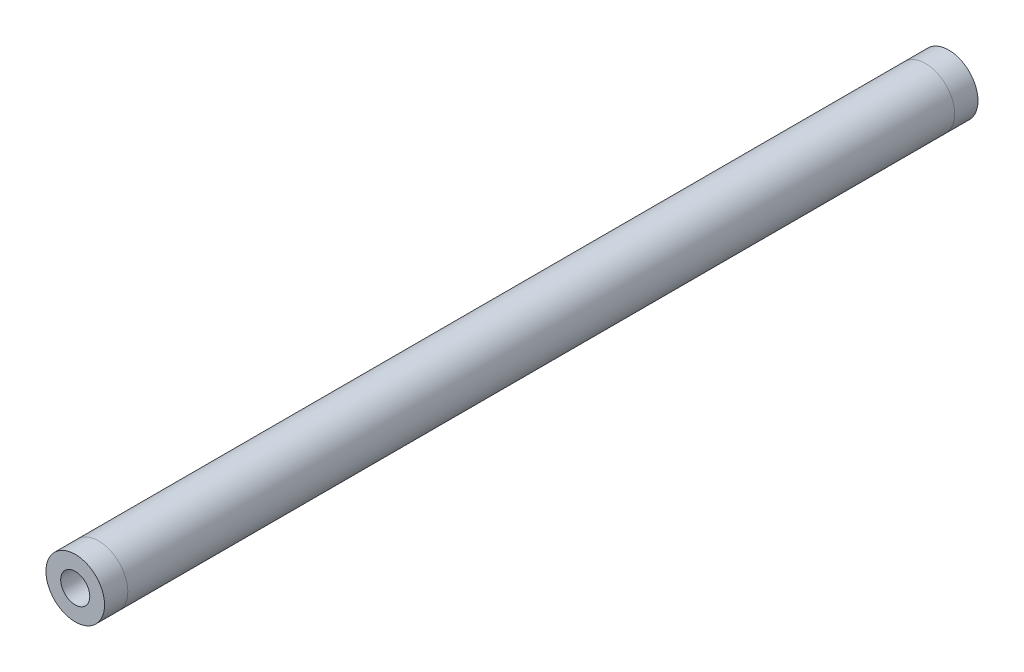
ISO-10303-21;
HEADER;
FILE_DESCRIPTION(('STEP AP214'),'2;1');
FILE_NAME('part.step','',(''),(''),'','','');
FILE_SCHEMA(('AUTOMOTIVE_DESIGN { 1 0 10303 214 1 1 1 1 }'));
ENDSEC;
DATA;
#1=APPLICATION_CONTEXT('core data for automotive mechanical design processes');
#2=APPLICATION_PROTOCOL_DEFINITION('international standard','automotive_design',2000,#1);
#3=PRODUCT_CONTEXT('',#1,'mechanical');
#4=PRODUCT('Part','Part','',(#3));
#5=PRODUCT_RELATED_PRODUCT_CATEGORY('part','',(#4));
#6=PRODUCT_DEFINITION_FORMATION('','',#4);
#7=PRODUCT_DEFINITION_CONTEXT('part definition',#1,'design');
#8=PRODUCT_DEFINITION('design','',#6,#7);
#9=PRODUCT_DEFINITION_SHAPE('','',#8);
#10=(LENGTH_UNIT() NAMED_UNIT(*) SI_UNIT(.MILLI.,.METRE.));
#11=(NAMED_UNIT(*) PLANE_ANGLE_UNIT() SI_UNIT($,.RADIAN.));
#12=(NAMED_UNIT(*) SI_UNIT($,.STERADIAN.) SOLID_ANGLE_UNIT());
#13=UNCERTAINTY_MEASURE_WITH_UNIT(LENGTH_MEASURE(1.E-05),#10,'distance_accuracy_value','');
#14=(GEOMETRIC_REPRESENTATION_CONTEXT(3) GLOBAL_UNCERTAINTY_ASSIGNED_CONTEXT((#13)) GLOBAL_UNIT_ASSIGNED_CONTEXT((#10,
#11,#12)) REPRESENTATION_CONTEXT('',''));
#15=CARTESIAN_POINT('',(0.,0.,0.));
#16=DIRECTION('',(0.,0.,1.));
#17=DIRECTION('',(1.,0.,0.));
#18=AXIS2_PLACEMENT_3D('',#15,#16,#17);
#19=CARTESIAN_POINT('',(0.,0.,-238.513185028254));
#20=DIRECTION('',(0.,0.,1.));
#21=DIRECTION('',(1.,0.,0.));
#22=AXIS2_PLACEMENT_3D('',#19,#20,#21);
#23=CYLINDRICAL_SURFACE('',#22,8.001);
#24=CARTESIAN_POINT('',(0.,0.,-238.513185028254));
#25=DIRECTION('',(0.,0.,1.));
#26=DIRECTION('',(1.,0.,0.));
#27=AXIS2_PLACEMENT_3D('',#24,#25,#26);
#28=CIRCLE('',#27,8.001);
#29=CARTESIAN_POINT('',(8.001,0.,-238.513185028254));
#30=VERTEX_POINT('',#29);
#31=EDGE_CURVE('E83',#30,#30,#28,.T.);
#32=ORIENTED_EDGE('',*,*,#31,.T.);
#33=EDGE_LOOP('',(#32));
#34=FACE_BOUND('',#33,.T.);
#35=CARTESIAN_POINT('',(0.,0.,-232.163185028254));
#36=DIRECTION('',(0.,0.,1.));
#37=DIRECTION('',(1.,0.,0.));
#38=AXIS2_PLACEMENT_3D('',#35,#36,#37);
#39=CIRCLE('',#38,8.001);
#40=CARTESIAN_POINT('',(8.001,0.,-232.163185028254));
#41=VERTEX_POINT('',#40);
#42=EDGE_CURVE('E79',#41,#41,#39,.T.);
#43=ORIENTED_EDGE('',*,*,#42,.F.);
#44=EDGE_LOOP('',(#43));
#45=FACE_BOUND('',#44,.T.);
#46=ADVANCED_FACE('F76',(#34,#45),#23,.T.);
#47=CARTESIAN_POINT('',(0.,0.,-238.513185028254));
#48=DIRECTION('',(0.,0.,1.));
#49=DIRECTION('',(1.,0.,0.));
#50=AXIS2_PLACEMENT_3D('',#47,#48,#49);
#51=PLANE('',#50);
#52=CARTESIAN_POINT('',(0.,0.,-238.513185028254));
#53=DIRECTION('',(0.,0.,1.));
#54=DIRECTION('',(1.,0.,0.));
#55=AXIS2_PLACEMENT_3D('',#52,#53,#54);
#56=CIRCLE('',#55,3.96875);
#57=CARTESIAN_POINT('',(3.96875,0.,-238.513185028254));
#58=VERTEX_POINT('',#57);
#59=EDGE_CURVE('E92',#58,#58,#56,.T.);
#60=ORIENTED_EDGE('',*,*,#59,.T.);
#61=EDGE_LOOP('',(#60));
#62=FACE_BOUND('',#61,.T.);
#63=ORIENTED_EDGE('',*,*,#31,.F.);
#64=EDGE_LOOP('',(#63));
#65=FACE_BOUND('',#64,.T.);
#66=ADVANCED_FACE('F119',(#62,#65),#51,.F.);
#67=CARTESIAN_POINT('',(0.,0.,-232.163185028254));
#68=DIRECTION('',(0.,0.,1.));
#69=DIRECTION('',(1.,0.,0.));
#70=AXIS2_PLACEMENT_3D('',#67,#68,#69);
#71=PLANE('',#70);
#72=CARTESIAN_POINT('',(0.,0.,-232.163185028254));
#73=DIRECTION('',(0.,0.,1.));
#74=DIRECTION('',(1.,0.,0.));
#75=AXIS2_PLACEMENT_3D('',#72,#73,#74);
#76=CIRCLE('',#75,6.477);
#77=CARTESIAN_POINT('',(-6.477,0.,-232.163185028254));
#78=VERTEX_POINT('',#77);
#79=EDGE_CURVE('E12',#78,#78,#76,.T.);
#80=ORIENTED_EDGE('',*,*,#79,.F.);
#81=EDGE_LOOP('',(#80));
#82=FACE_BOUND('',#81,.T.);
#83=ORIENTED_EDGE('',*,*,#42,.T.);
#84=EDGE_LOOP('',(#83));
#85=FACE_BOUND('',#84,.T.);
#86=ADVANCED_FACE('F115',(#82,#85),#71,.T.);
#87=CARTESIAN_POINT('',(0.,0.,-238.513185028254));
#88=DIRECTION('',(0.,0.,1.));
#89=DIRECTION('',(1.,0.,0.));
#90=AXIS2_PLACEMENT_3D('',#87,#88,#89);
#91=CYLINDRICAL_SURFACE('',#90,3.96875);
#92=ORIENTED_EDGE('',*,*,#59,.F.);
#93=EDGE_LOOP('',(#92));
#94=FACE_BOUND('',#93,.T.);
#95=CARTESIAN_POINT('',(0.,0.,-222.638185028254));
#96=DIRECTION('',(0.,0.,1.));
#97=DIRECTION('',(1.,0.,0.));
#98=AXIS2_PLACEMENT_3D('',#95,#96,#97);
#99=CIRCLE('',#98,3.96875);
#100=CARTESIAN_POINT('',(3.96875,0.,-222.638185028254));
#101=VERTEX_POINT('',#100);
#102=EDGE_CURVE('E98',#101,#101,#99,.T.);
#103=ORIENTED_EDGE('',*,*,#102,.T.);
#104=EDGE_LOOP('',(#103));
#105=FACE_BOUND('',#104,.T.);
#106=ADVANCED_FACE('F104',(#94,#105),#91,.F.);
#107=CARTESIAN_POINT('',(0.,0.,-222.638185028254));
#108=DIRECTION('',(0.,0.,1.));
#109=DIRECTION('',(1.,0.,0.));
#110=AXIS2_PLACEMENT_3D('',#107,#108,#109);
#111=PLANE('',#110);
#112=CARTESIAN_POINT('',(0.,0.,-222.638185028254));
#113=DIRECTION('',(0.,0.,1.));
#114=DIRECTION('',(1.,0.,0.));
#115=AXIS2_PLACEMENT_3D('',#112,#113,#114);
#116=CIRCLE('',#115,6.477);
#117=CARTESIAN_POINT('',(-6.477,0.,-222.638185028254));
#118=VERTEX_POINT('',#117);
#119=EDGE_CURVE('E90',#118,#118,#116,.T.);
#120=ORIENTED_EDGE('',*,*,#119,.T.);
#121=EDGE_LOOP('',(#120));
#122=FACE_BOUND('',#121,.T.);
#123=ORIENTED_EDGE('',*,*,#102,.F.);
#124=EDGE_LOOP('',(#123));
#125=FACE_BOUND('',#124,.T.);
#126=ADVANCED_FACE('F106',(#122,#125),#111,.T.);
#127=CARTESIAN_POINT('',(0.,0.,-222.638185028254));
#128=DIRECTION('',(0.,0.,-1.));
#129=DIRECTION('',(-1.,0.,0.));
#130=AXIS2_PLACEMENT_3D('',#127,#128,#129);
#131=CYLINDRICAL_SURFACE('',#130,6.477);
#132=CARTESIAN_POINT('',(-6.477,0.,-222.638185028254));
#133=CARTESIAN_POINT('',(-6.477,0.,-222.737403778254));
#134=CARTESIAN_POINT('',(-6.477,0.,-222.836622528254));
#135=CARTESIAN_POINT('',(-6.477,0.,-223.035060028254));
#136=CARTESIAN_POINT('',(-6.477,0.,-223.134278778254));
#137=CARTESIAN_POINT('',(-6.477,0.,-223.332716278254));
#138=CARTESIAN_POINT('',(-6.477,0.,-223.431935028254));
#139=CARTESIAN_POINT('',(-6.477,0.,-223.630372528254));
#140=CARTESIAN_POINT('',(-6.477,0.,-223.729591278254));
#141=CARTESIAN_POINT('',(-6.477,0.,-223.928028778254));
#142=CARTESIAN_POINT('',(-6.477,0.,-224.027247528254));
#143=CARTESIAN_POINT('',(-6.477,0.,-224.225685028254));
#144=CARTESIAN_POINT('',(-6.477,0.,-224.324903778254));
#145=CARTESIAN_POINT('',(-6.477,0.,-224.523341278254));
#146=CARTESIAN_POINT('',(-6.477,0.,-224.622560028254));
#147=CARTESIAN_POINT('',(-6.477,0.,-224.820997528254));
#148=CARTESIAN_POINT('',(-6.477,0.,-224.920216278254));
#149=CARTESIAN_POINT('',(-6.477,0.,-225.118653778254));
#150=CARTESIAN_POINT('',(-6.477,0.,-225.217872528254));
#151=CARTESIAN_POINT('',(-6.477,0.,-225.416310028254));
#152=CARTESIAN_POINT('',(-6.477,0.,-225.515528778254));
#153=CARTESIAN_POINT('',(-6.477,0.,-225.713966278254));
#154=CARTESIAN_POINT('',(-6.477,0.,-225.813185028254));
#155=CARTESIAN_POINT('',(-6.477,0.,-226.011622528254));
#156=CARTESIAN_POINT('',(-6.477,0.,-226.110841278254));
#157=CARTESIAN_POINT('',(-6.477,0.,-226.309278778254));
#158=CARTESIAN_POINT('',(-6.477,0.,-226.408497528254));
#159=CARTESIAN_POINT('',(-6.477,0.,-226.606935028254));
#160=CARTESIAN_POINT('',(-6.477,0.,-226.706153778254));
#161=CARTESIAN_POINT('',(-6.477,0.,-226.904591278254));
#162=CARTESIAN_POINT('',(-6.477,0.,-227.003810028254));
#163=CARTESIAN_POINT('',(-6.477,0.,-227.202247528254));
#164=CARTESIAN_POINT('',(-6.477,0.,-227.301466278254));
#165=CARTESIAN_POINT('',(-6.477,0.,-227.499903778254));
#166=CARTESIAN_POINT('',(-6.477,0.,-227.599122528254));
#167=CARTESIAN_POINT('',(-6.477,0.,-227.797560028254));
#168=CARTESIAN_POINT('',(-6.477,0.,-227.896778778254));
#169=CARTESIAN_POINT('',(-6.477,0.,-228.095216278254));
#170=CARTESIAN_POINT('',(-6.477,0.,-228.194435028254));
#171=CARTESIAN_POINT('',(-6.477,0.,-228.392872528254));
#172=CARTESIAN_POINT('',(-6.477,0.,-228.492091278254));
#173=CARTESIAN_POINT('',(-6.477,0.,-228.690528778254));
#174=CARTESIAN_POINT('',(-6.477,0.,-228.789747528254));
#175=CARTESIAN_POINT('',(-6.477,0.,-228.988185028254));
#176=CARTESIAN_POINT('',(-6.477,0.,-229.087403778254));
#177=CARTESIAN_POINT('',(-6.477,0.,-229.285841278254));
#178=CARTESIAN_POINT('',(-6.477,0.,-229.385060028254));
#179=CARTESIAN_POINT('',(-6.477,0.,-229.583497528254));
#180=CARTESIAN_POINT('',(-6.477,0.,-229.682716278254));
#181=CARTESIAN_POINT('',(-6.477,0.,-229.881153778254));
#182=CARTESIAN_POINT('',(-6.477,0.,-229.980372528254));
#183=CARTESIAN_POINT('',(-6.477,0.,-230.178810028254));
#184=CARTESIAN_POINT('',(-6.477,0.,-230.278028778254));
#185=CARTESIAN_POINT('',(-6.477,0.,-230.476466278254));
#186=CARTESIAN_POINT('',(-6.477,0.,-230.575685028254));
#187=CARTESIAN_POINT('',(-6.477,0.,-230.774122528254));
#188=CARTESIAN_POINT('',(-6.477,0.,-230.873341278254));
#189=CARTESIAN_POINT('',(-6.477,0.,-231.071778778254));
#190=CARTESIAN_POINT('',(-6.477,0.,-231.170997528254));
#191=CARTESIAN_POINT('',(-6.477,0.,-231.369435028254));
#192=CARTESIAN_POINT('',(-6.477,0.,-231.468653778254));
#193=CARTESIAN_POINT('',(-6.477,0.,-231.667091278254));
#194=CARTESIAN_POINT('',(-6.477,0.,-231.766310028254));
#195=CARTESIAN_POINT('',(-6.477,0.,-231.964747528254));
#196=CARTESIAN_POINT('',(-6.477,0.,-232.063966278254));
#197=CARTESIAN_POINT('',(-6.477,0.,-232.163185028254));
#198=B_SPLINE_CURVE_WITH_KNOTS('',3,(#132,#133,#134,#135,#136,#137,#138,#139,#140,#141,#142,
#143,#144,#145,#146,#147,#148,#149,#150,#151,#152,#153,#154,#155,#156,#157,#158,#159,#160,#161,
#162,#163,#164,#165,#166,#167,#168,#169,#170,#171,#172,#173,#174,#175,#176,#177,#178,#179,#180,
#181,#182,#183,#184,#185,#186,#187,#188,#189,#190,#191,#192,#193,#194,#195,#196,#197),
.UNSPECIFIED.,.F.,.F.,(4,2,2,2,2,2,2,2,2,2,2,2,2,2,2,2,2,2,2,2,2,2,2,2,2,2,2,2,2,2,2,2,4),(0.,
0.29765625,0.5953125,0.892968750000001,1.190625,1.48828125,1.7859375,2.08359375,2.38125,
2.67890625,2.9765625,3.27421875,3.571875,3.86953125,4.1671875,4.46484375,4.7625,5.06015625,
5.3578125,5.65546875,5.953125,6.25078125,6.5484375,6.84609375,7.14375,7.44140625,7.7390625,
8.03671875000001,8.334375,8.63203125,8.92968750000001,9.22734375000001,9.52500000000001),.UNSPECIFIED.);
#199=EDGE_CURVE('BSEAM108',#118,#78,#198,.T.);
#200=ORIENTED_EDGE('',*,*,#119,.F.);
#201=ORIENTED_EDGE('',*,*,#79,.T.);
#202=ORIENTED_EDGE('',*,*,#199,.T.);
#203=ORIENTED_EDGE('',*,*,#199,.F.);
#204=EDGE_LOOP('',(#200,#202,#201,#203));
#205=FACE_BOUND('',#204,.T.);
#206=ADVANCED_FACE('F108',(#205),#131,.T.);
#207=CLOSED_SHELL('',(#46,#66,#86,#106,#126,#206));
#208=MANIFOLD_SOLID_BREP('B2',#207);
#209=CARTESIAN_POINT('',(0.,0.,-232.163185028254));
#210=DIRECTION('',(0.,0.,1.));
#211=DIRECTION('',(1.,0.,0.));
#212=AXIS2_PLACEMENT_3D('',#209,#210,#211);
#213=CYLINDRICAL_SURFACE('',#212,8.001);
#214=CARTESIAN_POINT('',(0.,0.,-232.163185028254));
#215=DIRECTION('',(0.,0.,1.));
#216=DIRECTION('',(1.,0.,0.));
#217=AXIS2_PLACEMENT_3D('',#214,#215,#216);
#218=CIRCLE('',#217,8.001);
#219=CARTESIAN_POINT('',(8.001,0.,-232.163185028254));
#220=VERTEX_POINT('',#219);
#221=EDGE_CURVE('E75',#220,#220,#218,.T.);
#222=ORIENTED_EDGE('',*,*,#221,.T.);
#223=EDGE_LOOP('',(#222));
#224=FACE_BOUND('',#223,.T.);
#225=CARTESIAN_POINT('',(0.,0.,-6.35));
#226=DIRECTION('',(0.,0.,1.));
#227=DIRECTION('',(1.,0.,0.));
#228=AXIS2_PLACEMENT_3D('',#225,#226,#227);
#229=CIRCLE('',#228,8.001);
#230=CARTESIAN_POINT('',(8.001,0.,-6.35));
#231=VERTEX_POINT('',#230);
#232=EDGE_CURVE('E191',#231,#231,#229,.T.);
#233=ORIENTED_EDGE('',*,*,#232,.F.);
#234=EDGE_LOOP('',(#233));
#235=FACE_BOUND('',#234,.T.);
#236=ADVANCED_FACE('F188',(#224,#235),#213,.T.);
#237=CARTESIAN_POINT('',(0.,0.,-232.163185028254));
#238=DIRECTION('',(0.,0.,1.));
#239=DIRECTION('',(1.,0.,0.));
#240=AXIS2_PLACEMENT_3D('',#237,#238,#239);
#241=PLANE('',#240);
#242=CARTESIAN_POINT('',(0.,0.,-232.163185028254));
#243=DIRECTION('',(0.,0.,1.));
#244=DIRECTION('',(1.,0.,0.));
#245=AXIS2_PLACEMENT_3D('',#242,#243,#244);
#246=CIRCLE('',#245,6.477);
#247=CARTESIAN_POINT('',(6.477,0.,-232.163185028254));
#248=VERTEX_POINT('',#247);
#249=EDGE_CURVE('E198',#248,#248,#246,.T.);
#250=ORIENTED_EDGE('',*,*,#249,.T.);
#251=EDGE_LOOP('',(#250));
#252=FACE_BOUND('',#251,.T.);
#253=ORIENTED_EDGE('',*,*,#221,.F.);
#254=EDGE_LOOP('',(#253));
#255=FACE_BOUND('',#254,.T.);
#256=ADVANCED_FACE('F206',(#252,#255),#241,.F.);
#257=CARTESIAN_POINT('',(0.,0.,-6.35));
#258=DIRECTION('',(0.,0.,1.));
#259=DIRECTION('',(1.,0.,0.));
#260=AXIS2_PLACEMENT_3D('',#257,#258,#259);
#261=PLANE('',#260);
#262=CARTESIAN_POINT('',(0.,0.,-6.35));
#263=DIRECTION('',(0.,0.,1.));
#264=DIRECTION('',(1.,0.,0.));
#265=AXIS2_PLACEMENT_3D('',#262,#263,#264);
#266=CIRCLE('',#265,6.477);
#267=CARTESIAN_POINT('',(6.477,0.,-6.35));
#268=VERTEX_POINT('',#267);
#269=EDGE_CURVE('E200',#268,#268,#266,.T.);
#270=ORIENTED_EDGE('',*,*,#269,.F.);
#271=EDGE_LOOP('',(#270));
#272=FACE_BOUND('',#271,.T.);
#273=ORIENTED_EDGE('',*,*,#232,.T.);
#274=EDGE_LOOP('',(#273));
#275=FACE_BOUND('',#274,.T.);
#276=ADVANCED_FACE('F212',(#272,#275),#261,.T.);
#277=CARTESIAN_POINT('',(0.,0.,-232.163185028254));
#278=DIRECTION('',(0.,0.,1.));
#279=DIRECTION('',(1.,0.,0.));
#280=AXIS2_PLACEMENT_3D('',#277,#278,#279);
#281=CYLINDRICAL_SURFACE('',#280,6.477);
#282=ORIENTED_EDGE('',*,*,#249,.F.);
#283=EDGE_LOOP('',(#282));
#284=FACE_BOUND('',#283,.T.);
#285=ORIENTED_EDGE('',*,*,#269,.T.);
#286=EDGE_LOOP('',(#285));
#287=FACE_BOUND('',#286,.T.);
#288=ADVANCED_FACE('F209',(#284,#287),#281,.F.);
#289=CLOSED_SHELL('',(#236,#256,#276,#288));
#290=MANIFOLD_SOLID_BREP('B7',#289);
#291=CARTESIAN_POINT('',(0.,0.,-6.35));
#292=DIRECTION('',(0.,0.,1.));
#293=DIRECTION('',(1.,0.,0.));
#294=AXIS2_PLACEMENT_3D('',#291,#292,#293);
#295=CYLINDRICAL_SURFACE('',#294,8.001);
#296=CARTESIAN_POINT('',(0.,0.,-6.35));
#297=DIRECTION('',(0.,0.,1.));
#298=DIRECTION('',(1.,0.,0.));
#299=AXIS2_PLACEMENT_3D('',#296,#297,#298);
#300=CIRCLE('',#299,8.001);
#301=CARTESIAN_POINT('',(8.001,0.,-6.35));
#302=VERTEX_POINT('',#301);
#303=EDGE_CURVE('E187',#302,#302,#300,.T.);
#304=ORIENTED_EDGE('',*,*,#303,.T.);
#305=EDGE_LOOP('',(#304));
#306=FACE_BOUND('',#305,.T.);
#307=CARTESIAN_POINT('',(0.,0.,0.));
#308=DIRECTION('',(0.,0.,1.));
#309=DIRECTION('',(1.,0.,0.));
#310=AXIS2_PLACEMENT_3D('',#307,#308,#309);
#311=CIRCLE('',#310,8.001);
#312=CARTESIAN_POINT('',(8.001,0.,0.));
#313=VERTEX_POINT('',#312);
#314=EDGE_CURVE('E261',#313,#313,#311,.T.);
#315=ORIENTED_EDGE('',*,*,#314,.F.);
#316=EDGE_LOOP('',(#315));
#317=FACE_BOUND('',#316,.T.);
#318=ADVANCED_FACE('F250',(#306,#317),#295,.T.);
#319=CARTESIAN_POINT('',(0.,0.,-6.35));
#320=DIRECTION('',(0.,0.,1.));
#321=DIRECTION('',(1.,0.,0.));
#322=AXIS2_PLACEMENT_3D('',#319,#320,#321);
#323=CYLINDRICAL_SURFACE('',#322,3.96875);
#324=CARTESIAN_POINT('',(0.,0.,0.));
#325=DIRECTION('',(0.,0.,1.));
#326=DIRECTION('',(1.,0.,0.));
#327=AXIS2_PLACEMENT_3D('',#324,#325,#326);
#328=CIRCLE('',#327,3.96875);
#329=CARTESIAN_POINT('',(3.96875,0.,0.));
#330=VERTEX_POINT('',#329);
#331=EDGE_CURVE('E253',#330,#330,#328,.T.);
#332=ORIENTED_EDGE('',*,*,#331,.T.);
#333=EDGE_LOOP('',(#332));
#334=FACE_BOUND('',#333,.T.);
#335=CARTESIAN_POINT('',(0.,0.,-15.875));
#336=DIRECTION('',(0.,0.,1.));
#337=DIRECTION('',(1.,0.,0.));
#338=AXIS2_PLACEMENT_3D('',#335,#336,#337);
#339=CIRCLE('',#338,3.96875);
#340=CARTESIAN_POINT('',(3.96875,0.,-15.875));
#341=VERTEX_POINT('',#340);
#342=EDGE_CURVE('E273',#341,#341,#339,.T.);
#343=ORIENTED_EDGE('',*,*,#342,.F.);
#344=EDGE_LOOP('',(#343));
#345=FACE_BOUND('',#344,.T.);
#346=ADVANCED_FACE('F281',(#334,#345),#323,.F.);
#347=CARTESIAN_POINT('',(0.,0.,-6.35));
#348=DIRECTION('',(0.,0.,1.));
#349=DIRECTION('',(1.,0.,0.));
#350=AXIS2_PLACEMENT_3D('',#347,#348,#349);
#351=PLANE('',#350);
#352=CARTESIAN_POINT('',(0.,0.,-6.35));
#353=DIRECTION('',(0.,0.,1.));
#354=DIRECTION('',(1.,0.,0.));
#355=AXIS2_PLACEMENT_3D('',#352,#353,#354);
#356=CIRCLE('',#355,6.477);
#357=CARTESIAN_POINT('',(6.477,0.,-6.35));
#358=VERTEX_POINT('',#357);
#359=EDGE_CURVE('E263',#358,#358,#356,.T.);
#360=ORIENTED_EDGE('',*,*,#359,.T.);
#361=EDGE_LOOP('',(#360));
#362=FACE_BOUND('',#361,.T.);
#363=ORIENTED_EDGE('',*,*,#303,.F.);
#364=EDGE_LOOP('',(#363));
#365=FACE_BOUND('',#364,.T.);
#366=ADVANCED_FACE('F283',(#362,#365),#351,.F.);
#367=CARTESIAN_POINT('',(0.,0.,0.));
#368=DIRECTION('',(0.,0.,1.));
#369=DIRECTION('',(1.,0.,0.));
#370=AXIS2_PLACEMENT_3D('',#367,#368,#369);
#371=PLANE('',#370);
#372=ORIENTED_EDGE('',*,*,#314,.T.);
#373=EDGE_LOOP('',(#372));
#374=FACE_BOUND('',#373,.T.);
#375=ORIENTED_EDGE('',*,*,#331,.F.);
#376=EDGE_LOOP('',(#375));
#377=FACE_BOUND('',#376,.T.);
#378=ADVANCED_FACE('F289',(#374,#377),#371,.T.);
#379=CARTESIAN_POINT('',(0.,0.,-15.875));
#380=DIRECTION('',(0.,0.,1.));
#381=DIRECTION('',(1.,0.,0.));
#382=AXIS2_PLACEMENT_3D('',#379,#380,#381);
#383=CYLINDRICAL_SURFACE('',#382,6.477);
#384=CARTESIAN_POINT('',(0.,0.,-15.875));
#385=DIRECTION('',(0.,0.,1.));
#386=DIRECTION('',(1.,0.,0.));
#387=AXIS2_PLACEMENT_3D('',#384,#385,#386);
#388=CIRCLE('',#387,6.477);
#389=CARTESIAN_POINT('',(6.477,0.,-15.875));
#390=VERTEX_POINT('',#389);
#391=EDGE_CURVE('E266',#390,#390,#388,.T.);
#392=CARTESIAN_POINT('',(6.477,0.,-15.875));
#393=CARTESIAN_POINT('',(6.477,0.,-15.77578125));
#394=CARTESIAN_POINT('',(6.477,0.,-15.6765625));
#395=CARTESIAN_POINT('',(6.477,0.,-15.478125));
#396=CARTESIAN_POINT('',(6.477,0.,-15.37890625));
#397=CARTESIAN_POINT('',(6.477,0.,-15.18046875));
#398=CARTESIAN_POINT('',(6.477,0.,-15.08125));
#399=CARTESIAN_POINT('',(6.477,0.,-14.8828125));
#400=CARTESIAN_POINT('',(6.477,0.,-14.78359375));
#401=CARTESIAN_POINT('',(6.477,0.,-14.58515625));
#402=CARTESIAN_POINT('',(6.477,0.,-14.4859375));
#403=CARTESIAN_POINT('',(6.477,0.,-14.2875));
#404=CARTESIAN_POINT('',(6.477,0.,-14.18828125));
#405=CARTESIAN_POINT('',(6.477,0.,-13.98984375));
#406=CARTESIAN_POINT('',(6.477,0.,-13.890625));
#407=CARTESIAN_POINT('',(6.477,0.,-13.6921875));
#408=CARTESIAN_POINT('',(6.477,0.,-13.59296875));
#409=CARTESIAN_POINT('',(6.477,0.,-13.39453125));
#410=CARTESIAN_POINT('',(6.477,0.,-13.2953125));
#411=CARTESIAN_POINT('',(6.477,0.,-13.096875));
#412=CARTESIAN_POINT('',(6.477,0.,-12.99765625));
#413=CARTESIAN_POINT('',(6.477,0.,-12.79921875));
#414=CARTESIAN_POINT('',(6.477,0.,-12.7));
#415=CARTESIAN_POINT('',(6.477,0.,-12.5015625));
#416=CARTESIAN_POINT('',(6.477,0.,-12.40234375));
#417=CARTESIAN_POINT('',(6.477,0.,-12.20390625));
#418=CARTESIAN_POINT('',(6.477,0.,-12.1046875));
#419=CARTESIAN_POINT('',(6.477,0.,-11.90625));
#420=CARTESIAN_POINT('',(6.477,0.,-11.80703125));
#421=CARTESIAN_POINT('',(6.477,0.,-11.60859375));
#422=CARTESIAN_POINT('',(6.477,0.,-11.509375));
#423=CARTESIAN_POINT('',(6.477,0.,-11.3109375));
#424=CARTESIAN_POINT('',(6.477,0.,-11.21171875));
#425=CARTESIAN_POINT('',(6.477,0.,-11.01328125));
#426=CARTESIAN_POINT('',(6.477,0.,-10.9140625));
#427=CARTESIAN_POINT('',(6.477,0.,-10.715625));
#428=CARTESIAN_POINT('',(6.477,0.,-10.61640625));
#429=CARTESIAN_POINT('',(6.477,0.,-10.41796875));
#430=CARTESIAN_POINT('',(6.477,0.,-10.31875));
#431=CARTESIAN_POINT('',(6.477,0.,-10.1203125));
#432=CARTESIAN_POINT('',(6.477,0.,-10.02109375));
#433=CARTESIAN_POINT('',(6.477,0.,-9.82265625));
#434=CARTESIAN_POINT('',(6.477,0.,-9.7234375));
#435=CARTESIAN_POINT('',(6.477,0.,-9.525));
#436=CARTESIAN_POINT('',(6.477,0.,-9.42578125));
#437=CARTESIAN_POINT('',(6.477,0.,-9.22734375));
#438=CARTESIAN_POINT('',(6.477,0.,-9.128125));
#439=CARTESIAN_POINT('',(6.477,0.,-8.9296875));
#440=CARTESIAN_POINT('',(6.477,0.,-8.83046875));
#441=CARTESIAN_POINT('',(6.477,0.,-8.63203125));
#442=CARTESIAN_POINT('',(6.477,0.,-8.5328125));
#443=CARTESIAN_POINT('',(6.477,0.,-8.334375));
#444=CARTESIAN_POINT('',(6.477,0.,-8.23515625));
#445=CARTESIAN_POINT('',(6.477,0.,-8.03671875));
#446=CARTESIAN_POINT('',(6.477,0.,-7.9375));
#447=CARTESIAN_POINT('',(6.477,0.,-7.7390625));
#448=CARTESIAN_POINT('',(6.477,0.,-7.63984375));
#449=CARTESIAN_POINT('',(6.477,0.,-7.44140625));
#450=CARTESIAN_POINT('',(6.477,0.,-7.3421875));
#451=CARTESIAN_POINT('',(6.477,0.,-7.14375));
#452=CARTESIAN_POINT('',(6.477,0.,-7.04453125));
#453=CARTESIAN_POINT('',(6.477,0.,-6.84609375));
#454=CARTESIAN_POINT('',(6.477,0.,-6.746875));
#455=CARTESIAN_POINT('',(6.477,0.,-6.5484375));
#456=CARTESIAN_POINT('',(6.477,0.,-6.44921875));
#457=CARTESIAN_POINT('',(6.477,0.,-6.35));
#458=B_SPLINE_CURVE_WITH_KNOTS('',3,(#392,#393,#394,#395,#396,#397,#398,#399,#400,#401,#402,
#403,#404,#405,#406,#407,#408,#409,#410,#411,#412,#413,#414,#415,#416,#417,#418,#419,#420,#421,
#422,#423,#424,#425,#426,#427,#428,#429,#430,#431,#432,#433,#434,#435,#436,#437,#438,#439,#440,
#441,#442,#443,#444,#445,#446,#447,#448,#449,#450,#451,#452,#453,#454,#455,#456,#457),
.UNSPECIFIED.,.F.,.F.,(4,2,2,2,2,2,2,2,2,2,2,2,2,2,2,2,2,2,2,2,2,2,2,2,2,2,2,2,2,2,2,2,4),(0.,
0.297656250000002,0.595312500000002,0.892968750000002,1.190625,1.48828125,1.7859375,2.08359375,
2.38125,2.67890625,2.9765625,3.27421875,3.571875,3.86953125,4.1671875,4.46484375,4.7625,
5.06015625,5.3578125,5.65546875,5.953125,6.25078125,6.5484375,6.84609375,7.14375,7.44140625,
7.7390625,8.03671875,8.334375,8.63203125,8.9296875,9.22734375,9.525),.UNSPECIFIED.);
#459=EDGE_CURVE('BSEAM294',#390,#358,#458,.T.);
#460=ORIENTED_EDGE('',*,*,#391,.T.);
#461=ORIENTED_EDGE('',*,*,#359,.F.);
#462=ORIENTED_EDGE('',*,*,#459,.T.);
#463=ORIENTED_EDGE('',*,*,#459,.F.);
#464=EDGE_LOOP('',(#460,#462,#461,#463));
#465=FACE_BOUND('',#464,.T.);
#466=ADVANCED_FACE('F294',(#465),#383,.T.);
#467=CARTESIAN_POINT('',(0.,0.,-15.875));
#468=DIRECTION('',(0.,0.,1.));
#469=DIRECTION('',(1.,0.,0.));
#470=AXIS2_PLACEMENT_3D('',#467,#468,#469);
#471=PLANE('',#470);
#472=ORIENTED_EDGE('',*,*,#342,.T.);
#473=EDGE_LOOP('',(#472));
#474=FACE_BOUND('',#473,.T.);
#475=ORIENTED_EDGE('',*,*,#391,.F.);
#476=EDGE_LOOP('',(#475));
#477=FACE_BOUND('',#476,.T.);
#478=ADVANCED_FACE('F278',(#474,#477),#471,.F.);
#479=CLOSED_SHELL('',(#318,#346,#366,#378,#466,#478));
#480=MANIFOLD_SOLID_BREP('B70',#479);
#481=ADVANCED_BREP_SHAPE_REPRESENTATION('',(#18,#208,#290,#480),#14);
#482=SHAPE_DEFINITION_REPRESENTATION(#9,#481);
ENDSEC;
END-ISO-10303-21;
